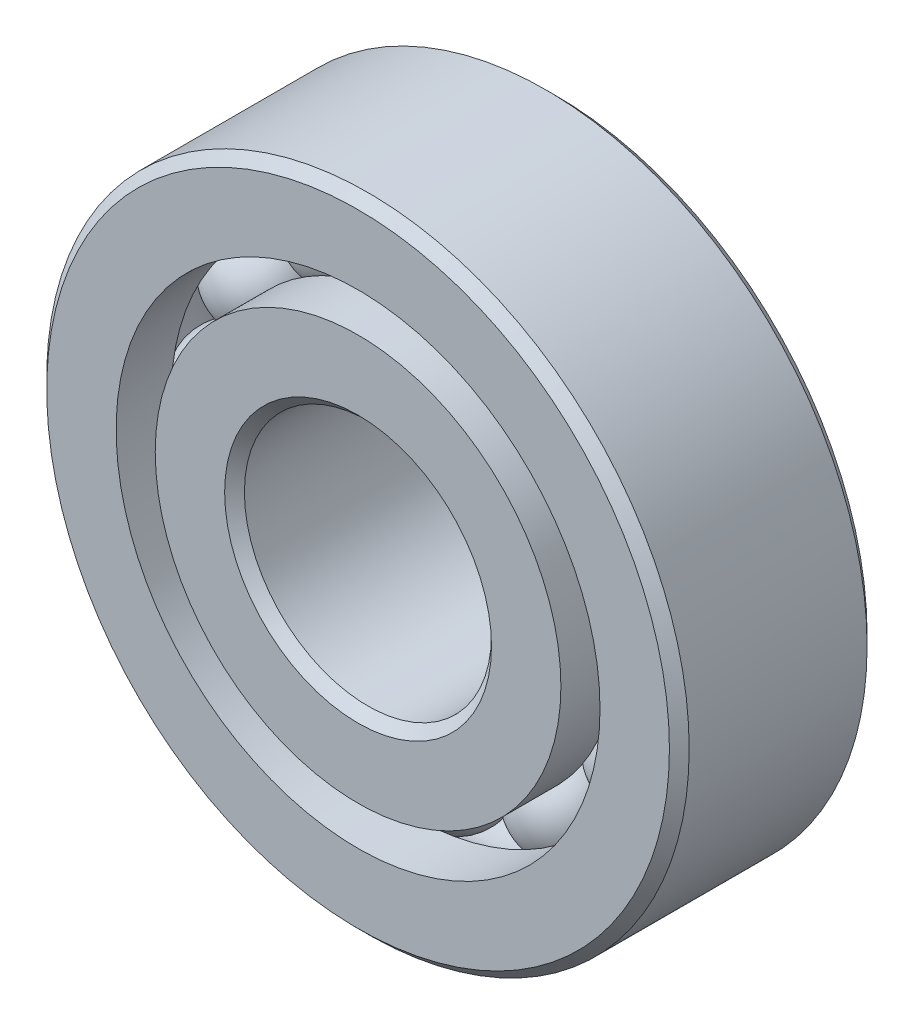
ISO-10303-21;
HEADER;
FILE_DESCRIPTION(('STEP AP214'),'2;1');
FILE_NAME('part.step','',(''),(''),'','','');
FILE_SCHEMA(('AUTOMOTIVE_DESIGN { 1 0 10303 214 1 1 1 1 }'));
ENDSEC;
DATA;
#1=APPLICATION_CONTEXT('core data for automotive mechanical design processes');
#2=APPLICATION_PROTOCOL_DEFINITION('international standard','automotive_design',2000,#1);
#3=PRODUCT_CONTEXT('',#1,'mechanical');
#4=PRODUCT('Part','Part','',(#3));
#5=PRODUCT_RELATED_PRODUCT_CATEGORY('part','',(#4));
#6=PRODUCT_DEFINITION_FORMATION('','',#4);
#7=PRODUCT_DEFINITION_CONTEXT('part definition',#1,'design');
#8=PRODUCT_DEFINITION('design','',#6,#7);
#9=PRODUCT_DEFINITION_SHAPE('','',#8);
#10=(LENGTH_UNIT() NAMED_UNIT(*) SI_UNIT(.MILLI.,.METRE.));
#11=(NAMED_UNIT(*) PLANE_ANGLE_UNIT() SI_UNIT($,.RADIAN.));
#12=(NAMED_UNIT(*) SI_UNIT($,.STERADIAN.) SOLID_ANGLE_UNIT());
#13=UNCERTAINTY_MEASURE_WITH_UNIT(LENGTH_MEASURE(1.E-05),#10,'distance_accuracy_value','');
#14=(GEOMETRIC_REPRESENTATION_CONTEXT(3) GLOBAL_UNCERTAINTY_ASSIGNED_CONTEXT((#13)) GLOBAL_UNIT_ASSIGNED_CONTEXT((#10,
#11,#12)) REPRESENTATION_CONTEXT('',''));
#15=CARTESIAN_POINT('',(0.,0.,0.));
#16=DIRECTION('',(0.,0.,1.));
#17=DIRECTION('',(1.,0.,0.));
#18=AXIS2_PLACEMENT_3D('',#15,#16,#17);
#19=CARTESIAN_POINT('',(-4.4999999999999,7.79422863406,0.));
#20=DIRECTION('',(0.,0.,1.));
#21=DIRECTION('',(-0.499999999999989,0.866025403784445,0.));
#22=AXIS2_PLACEMENT_3D('',#19,#20,#21);
#23=SPHERICAL_SURFACE('',#22,1.94589444175335);
#24=CARTESIAN_POINT('',(-4.4999999999999,7.79422863406,1.94589444175335));
#25=VERTEX_POINT('',#24);
#26=VERTEX_LOOP('',#25);
#27=FACE_BOUND('',#26,.T.);
#28=ADVANCED_FACE('F37',(#27),#23,.T.);
#29=CLOSED_SHELL('',(#28));
#30=MANIFOLD_SOLID_BREP('B2',#29);
#31=CARTESIAN_POINT('',(-7.79422863405989,4.50000000000009,0.));
#32=DIRECTION('',(0.,0.,1.));
#33=DIRECTION('',(-0.866025403784433,0.50000000000001,0.));
#34=AXIS2_PLACEMENT_3D('',#31,#32,#33);
#35=SPHERICAL_SURFACE('',#34,1.94589444175335);
#36=CARTESIAN_POINT('',(-7.79422863405989,4.50000000000009,1.94589444175335));
#37=VERTEX_POINT('',#36);
#38=VERTEX_LOOP('',#37);
#39=FACE_BOUND('',#38,.T.);
#40=ADVANCED_FACE('F57',(#39),#35,.T.);
#41=CLOSED_SHELL('',(#40));
#42=MANIFOLD_SOLID_BREP('B6',#41);
#43=CARTESIAN_POINT('',(-9.,0.,0.));
#44=DIRECTION('',(0.,0.,1.));
#45=DIRECTION('',(-1.,0.,0.));
#46=AXIS2_PLACEMENT_3D('',#43,#44,#45);
#47=SPHERICAL_SURFACE('',#46,1.94589444175335);
#48=CARTESIAN_POINT('',(-9.,0.,1.94589444175335));
#49=VERTEX_POINT('',#48);
#50=VERTEX_LOOP('',#49);
#51=FACE_BOUND('',#50,.T.);
#52=ADVANCED_FACE('F77',(#51),#47,.T.);
#53=CLOSED_SHELL('',(#52));
#54=MANIFOLD_SOLID_BREP('B33',#53);
#55=CARTESIAN_POINT('',(-7.79422863405999,-4.49999999999993,0.));
#56=DIRECTION('',(0.,0.,1.));
#57=DIRECTION('',(-0.866025403784443,-0.499999999999992,0.));
#58=AXIS2_PLACEMENT_3D('',#55,#56,#57);
#59=SPHERICAL_SURFACE('',#58,1.94589444175335);
#60=CARTESIAN_POINT('',(-7.79422863405999,-4.49999999999993,1.94589444175335));
#61=VERTEX_POINT('',#60);
#62=VERTEX_LOOP('',#61);
#63=FACE_BOUND('',#62,.T.);
#64=ADVANCED_FACE('F97',(#63),#59,.T.);
#65=CLOSED_SHELL('',(#64));
#66=MANIFOLD_SOLID_BREP('B53',#65);
#67=CARTESIAN_POINT('',(-4.50000000000006,-7.79422863405991,0.));
#68=DIRECTION('',(0.,0.,1.));
#69=DIRECTION('',(-0.500000000000007,-0.866025403784435,0.));
#70=AXIS2_PLACEMENT_3D('',#67,#68,#69);
#71=SPHERICAL_SURFACE('',#70,1.94589444175335);
#72=CARTESIAN_POINT('',(-4.50000000000006,-7.79422863405991,1.94589444175335));
#73=VERTEX_POINT('',#72);
#74=VERTEX_LOOP('',#73);
#75=FACE_BOUND('',#74,.T.);
#76=ADVANCED_FACE('F117',(#75),#71,.T.);
#77=CLOSED_SHELL('',(#76));
#78=MANIFOLD_SOLID_BREP('B73',#77);
#79=CARTESIAN_POINT('',(0.,-9.,0.));
#80=DIRECTION('',(0.,0.,1.));
#81=DIRECTION('',(0.,-1.,0.));
#82=AXIS2_PLACEMENT_3D('',#79,#80,#81);
#83=SPHERICAL_SURFACE('',#82,1.94589444175335);
#84=CARTESIAN_POINT('',(0.,-9.,1.94589444175335));
#85=VERTEX_POINT('',#84);
#86=VERTEX_LOOP('',#85);
#87=FACE_BOUND('',#86,.T.);
#88=ADVANCED_FACE('F137',(#87),#83,.T.);
#89=CLOSED_SHELL('',(#88));
#90=MANIFOLD_SOLID_BREP('B93',#89);
#91=CARTESIAN_POINT('',(4.49999999999995,-7.79422863405997,0.));
#92=DIRECTION('',(0.,0.,1.));
#93=DIRECTION('',(0.499999999999995,-0.866025403784442,0.));
#94=AXIS2_PLACEMENT_3D('',#91,#92,#93);
#95=SPHERICAL_SURFACE('',#94,1.94589444175335);
#96=CARTESIAN_POINT('',(4.49999999999995,-7.79422863405997,1.94589444175335));
#97=VERTEX_POINT('',#96);
#98=VERTEX_LOOP('',#97);
#99=FACE_BOUND('',#98,.T.);
#100=ADVANCED_FACE('F157',(#99),#95,.T.);
#101=CLOSED_SHELL('',(#100));
#102=MANIFOLD_SOLID_BREP('B113',#101);
#103=CARTESIAN_POINT('',(7.79422863405993,-4.50000000000004,0.));
#104=DIRECTION('',(0.,0.,1.));
#105=DIRECTION('',(0.866025403784436,-0.500000000000004,0.));
#106=AXIS2_PLACEMENT_3D('',#103,#104,#105);
#107=SPHERICAL_SURFACE('',#106,1.94589444175335);
#108=CARTESIAN_POINT('',(7.79422863405993,-4.50000000000004,1.94589444175335));
#109=VERTEX_POINT('',#108);
#110=VERTEX_LOOP('',#109);
#111=FACE_BOUND('',#110,.T.);
#112=ADVANCED_FACE('F177',(#111),#107,.T.);
#113=CLOSED_SHELL('',(#112));
#114=MANIFOLD_SOLID_BREP('B133',#113);
#115=CARTESIAN_POINT('',(9.,0.,0.));
#116=DIRECTION('',(0.,0.,1.));
#117=DIRECTION('',(1.,0.,0.));
#118=AXIS2_PLACEMENT_3D('',#115,#116,#117);
#119=SPHERICAL_SURFACE('',#118,1.94589444175335);
#120=CARTESIAN_POINT('',(9.,0.,1.94589444175335));
#121=VERTEX_POINT('',#120);
#122=VERTEX_LOOP('',#121);
#123=FACE_BOUND('',#122,.T.);
#124=ADVANCED_FACE('F197',(#123),#119,.T.);
#125=CLOSED_SHELL('',(#124));
#126=MANIFOLD_SOLID_BREP('B153',#125);
#127=CARTESIAN_POINT('',(7.79422863405996,4.49999999999998,0.));
#128=DIRECTION('',(0.,0.,1.));
#129=DIRECTION('',(0.86602540378444,0.499999999999998,0.));
#130=AXIS2_PLACEMENT_3D('',#127,#128,#129);
#131=SPHERICAL_SURFACE('',#130,1.94589444175335);
#132=CARTESIAN_POINT('',(7.79422863405996,4.49999999999998,1.94589444175335));
#133=VERTEX_POINT('',#132);
#134=VERTEX_LOOP('',#133);
#135=FACE_BOUND('',#134,.T.);
#136=ADVANCED_FACE('F217',(#135),#131,.T.);
#137=CLOSED_SHELL('',(#136));
#138=MANIFOLD_SOLID_BREP('B173',#137);
#139=CARTESIAN_POINT('',(4.50000000000001,7.79422863405994,0.));
#140=DIRECTION('',(0.,0.,1.));
#141=DIRECTION('',(0.500000000000001,0.866025403784438,0.));
#142=AXIS2_PLACEMENT_3D('',#139,#140,#141);
#143=SPHERICAL_SURFACE('',#142,1.94589444175335);
#144=CARTESIAN_POINT('',(4.50000000000001,7.79422863405994,1.94589444175335));
#145=VERTEX_POINT('',#144);
#146=VERTEX_LOOP('',#145);
#147=FACE_BOUND('',#146,.T.);
#148=ADVANCED_FACE('F237',(#147),#143,.T.);
#149=CLOSED_SHELL('',(#148));
#150=MANIFOLD_SOLID_BREP('B193',#149);
#151=CARTESIAN_POINT('',(0.,9.,0.));
#152=DIRECTION('',(0.,0.,1.));
#153=DIRECTION('',(0.,1.,0.));
#154=AXIS2_PLACEMENT_3D('',#151,#152,#153);
#155=SPHERICAL_SURFACE('',#154,1.94589444175335);
#156=CARTESIAN_POINT('',(0.,9.,1.94589444175335));
#157=VERTEX_POINT('',#156);
#158=VERTEX_LOOP('',#157);
#159=FACE_BOUND('',#158,.T.);
#160=ADVANCED_FACE('F259',(#159),#155,.T.);
#161=CLOSED_SHELL('',(#160));
#162=MANIFOLD_SOLID_BREP('B213',#161);
#163=CARTESIAN_POINT('',(0.,8.20879120879121,4.));
#164=DIRECTION('',(0.,0.,-1.));
#165=DIRECTION('',(-1.,0.,0.));
#166=AXIS2_PLACEMENT_3D('',#163,#164,#165);
#167=PLANE('',#166);
#168=CARTESIAN_POINT('',(0.,0.,4.));
#169=DIRECTION('',(0.,0.,1.));
#170=DIRECTION('',(1.,0.,0.));
#171=AXIS2_PLACEMENT_3D('',#168,#169,#170);
#172=CIRCLE('',#171,5.4);
#173=CARTESIAN_POINT('',(5.4,0.,4.));
#174=VERTEX_POINT('',#173);
#175=EDGE_CURVE('E306',#174,#174,#172,.T.);
#176=ORIENTED_EDGE('',*,*,#175,.F.);
#177=EDGE_LOOP('',(#176));
#178=FACE_BOUND('',#177,.T.);
#179=CARTESIAN_POINT('',(0.,0.,4.));
#180=DIRECTION('',(0.,0.,1.));
#181=DIRECTION('',(1.,0.,0.));
#182=AXIS2_PLACEMENT_3D('',#179,#180,#181);
#183=CIRCLE('',#182,8.20879120879121);
#184=CARTESIAN_POINT('',(8.20879120879121,0.,4.));
#185=VERTEX_POINT('',#184);
#186=EDGE_CURVE('E258',#185,#185,#183,.T.);
#187=ORIENTED_EDGE('',*,*,#186,.T.);
#188=EDGE_LOOP('',(#187));
#189=FACE_BOUND('',#188,.T.);
#190=ADVANCED_FACE('F278',(#178,#189),#167,.F.);
#191=CARTESIAN_POINT('',(0.,0.,4.));
#192=DIRECTION('',(0.,0.,1.));
#193=DIRECTION('',(1.,0.,0.));
#194=AXIS2_PLACEMENT_3D('',#191,#192,#193);
#195=CYLINDRICAL_SURFACE('',#194,8.20879120879121);
#196=ORIENTED_EDGE('',*,*,#186,.F.);
#197=EDGE_LOOP('',(#196));
#198=FACE_BOUND('',#197,.T.);
#199=CARTESIAN_POINT('',(0.,0.,1.77777777777778));
#200=DIRECTION('',(0.,0.,1.));
#201=DIRECTION('',(1.,0.,0.));
#202=AXIS2_PLACEMENT_3D('',#199,#200,#201);
#203=CIRCLE('',#202,8.20879120879121);
#204=CARTESIAN_POINT('',(8.20879120879121,0.,1.77777777777778));
#205=VERTEX_POINT('',#204);
#206=EDGE_CURVE('E284',#205,#205,#203,.T.);
#207=ORIENTED_EDGE('',*,*,#206,.T.);
#208=EDGE_LOOP('',(#207));
#209=FACE_BOUND('',#208,.T.);
#210=ADVANCED_FACE('F313',(#198,#209),#195,.T.);
#211=CARTESIAN_POINT('',(0.,0.,0.));
#212=DIRECTION('',(0.,0.,1.));
#213=DIRECTION('',(1.,0.,0.));
#214=AXIS2_PLACEMENT_3D('',#211,#212,#213);
#215=TOROIDAL_SURFACE('',#214,9.,1.94589444175334);
#216=ORIENTED_EDGE('',*,*,#206,.F.);
#217=EDGE_LOOP('',(#216));
#218=FACE_BOUND('',#217,.T.);
#219=CARTESIAN_POINT('',(0.,0.,-1.77777777777778));
#220=DIRECTION('',(0.,0.,1.));
#221=DIRECTION('',(1.,0.,0.));
#222=AXIS2_PLACEMENT_3D('',#219,#220,#221);
#223=CIRCLE('',#222,8.20879120879121);
#224=CARTESIAN_POINT('',(8.20879120879121,0.,-1.77777777777778));
#225=VERTEX_POINT('',#224);
#226=EDGE_CURVE('E288',#225,#225,#223,.T.);
#227=ORIENTED_EDGE('',*,*,#226,.T.);
#228=EDGE_LOOP('',(#227));
#229=FACE_BOUND('',#228,.T.);
#230=ADVANCED_FACE('F317',(#218,#229),#215,.F.);
#231=CARTESIAN_POINT('',(0.,0.,4.));
#232=DIRECTION('',(0.,0.,1.));
#233=DIRECTION('',(1.,0.,0.));
#234=AXIS2_PLACEMENT_3D('',#231,#232,#233);
#235=CYLINDRICAL_SURFACE('',#234,8.20879120879121);
#236=ORIENTED_EDGE('',*,*,#226,.F.);
#237=EDGE_LOOP('',(#236));
#238=FACE_BOUND('',#237,.T.);
#239=CARTESIAN_POINT('',(0.,0.,-4.));
#240=DIRECTION('',(0.,0.,1.));
#241=DIRECTION('',(1.,0.,0.));
#242=AXIS2_PLACEMENT_3D('',#239,#240,#241);
#243=CIRCLE('',#242,8.20879120879121);
#244=CARTESIAN_POINT('',(8.20879120879121,0.,-4.));
#245=VERTEX_POINT('',#244);
#246=EDGE_CURVE('E292',#245,#245,#243,.T.);
#247=ORIENTED_EDGE('',*,*,#246,.T.);
#248=EDGE_LOOP('',(#247));
#249=FACE_BOUND('',#248,.T.);
#250=ADVANCED_FACE('F322',(#238,#249),#235,.T.);
#251=CARTESIAN_POINT('',(0.,5.4,-4.));
#252=DIRECTION('',(0.,0.,1.));
#253=DIRECTION('',(1.,0.,0.));
#254=AXIS2_PLACEMENT_3D('',#251,#252,#253);
#255=PLANE('',#254);
#256=ORIENTED_EDGE('',*,*,#246,.F.);
#257=EDGE_LOOP('',(#256));
#258=FACE_BOUND('',#257,.T.);
#259=CARTESIAN_POINT('',(0.,0.,-4.));
#260=DIRECTION('',(0.,0.,1.));
#261=DIRECTION('',(1.,0.,0.));
#262=AXIS2_PLACEMENT_3D('',#259,#260,#261);
#263=CIRCLE('',#262,5.4);
#264=CARTESIAN_POINT('',(5.4,0.,-4.));
#265=VERTEX_POINT('',#264);
#266=EDGE_CURVE('E297',#265,#265,#263,.T.);
#267=ORIENTED_EDGE('',*,*,#266,.T.);
#268=EDGE_LOOP('',(#267));
#269=FACE_BOUND('',#268,.T.);
#270=ADVANCED_FACE('F328',(#258,#269),#255,.F.);
#271=CARTESIAN_POINT('',(0.,0.,-3.6));
#272=DIRECTION('',(0.,0.,-1.));
#273=DIRECTION('',(-1.,0.,0.));
#274=AXIS2_PLACEMENT_3D('',#271,#272,#273);
#275=CONICAL_SURFACE('',#274,5.,0.785398163397444);
#276=ORIENTED_EDGE('',*,*,#266,.F.);
#277=EDGE_LOOP('',(#276));
#278=FACE_BOUND('',#277,.T.);
#279=CARTESIAN_POINT('',(0.,0.,-3.6));
#280=DIRECTION('',(0.,0.,1.));
#281=DIRECTION('',(1.,0.,0.));
#282=AXIS2_PLACEMENT_3D('',#279,#280,#281);
#283=CIRCLE('',#282,5.);
#284=CARTESIAN_POINT('',(5.,0.,-3.6));
#285=VERTEX_POINT('',#284);
#286=EDGE_CURVE('E300',#285,#285,#283,.T.);
#287=ORIENTED_EDGE('',*,*,#286,.T.);
#288=EDGE_LOOP('',(#287));
#289=FACE_BOUND('',#288,.T.);
#290=ADVANCED_FACE('F332',(#278,#289),#275,.F.);
#291=CARTESIAN_POINT('',(0.,0.,4.));
#292=DIRECTION('',(0.,0.,1.));
#293=DIRECTION('',(1.,0.,0.));
#294=AXIS2_PLACEMENT_3D('',#291,#292,#293);
#295=CYLINDRICAL_SURFACE('',#294,5.);
#296=ORIENTED_EDGE('',*,*,#286,.F.);
#297=EDGE_LOOP('',(#296));
#298=FACE_BOUND('',#297,.T.);
#299=CARTESIAN_POINT('',(0.,0.,3.6));
#300=DIRECTION('',(0.,0.,1.));
#301=DIRECTION('',(1.,0.,0.));
#302=AXIS2_PLACEMENT_3D('',#299,#300,#301);
#303=CIRCLE('',#302,5.);
#304=CARTESIAN_POINT('',(5.,0.,3.6));
#305=VERTEX_POINT('',#304);
#306=EDGE_CURVE('E303',#305,#305,#303,.T.);
#307=ORIENTED_EDGE('',*,*,#306,.T.);
#308=EDGE_LOOP('',(#307));
#309=FACE_BOUND('',#308,.T.);
#310=ADVANCED_FACE('F336',(#298,#309),#295,.F.);
#311=CARTESIAN_POINT('',(0.,0.,4.));
#312=DIRECTION('',(0.,0.,1.));
#313=DIRECTION('',(1.,0.,0.));
#314=AXIS2_PLACEMENT_3D('',#311,#312,#313);
#315=CONICAL_SURFACE('',#314,5.4,0.785398163397452);
#316=ORIENTED_EDGE('',*,*,#306,.F.);
#317=EDGE_LOOP('',(#316));
#318=FACE_BOUND('',#317,.T.);
#319=ORIENTED_EDGE('',*,*,#175,.T.);
#320=EDGE_LOOP('',(#319));
#321=FACE_BOUND('',#320,.T.);
#322=ADVANCED_FACE('F310',(#318,#321),#315,.F.);
#323=CLOSED_SHELL('',(#190,#210,#230,#250,#270,#290,#310,#322));
#324=MANIFOLD_SOLID_BREP('B233',#323);
#325=CARTESIAN_POINT('',(0.,0.,3.6));
#326=DIRECTION('',(0.,0.,-1.));
#327=DIRECTION('',(-1.,0.,0.));
#328=AXIS2_PLACEMENT_3D('',#325,#326,#327);
#329=CONICAL_SURFACE('',#328,13.,0.785398163397447);
#330=CARTESIAN_POINT('',(0.,0.,4.));
#331=DIRECTION('',(0.,0.,1.));
#332=DIRECTION('',(1.,0.,0.));
#333=AXIS2_PLACEMENT_3D('',#330,#331,#332);
#334=CIRCLE('',#333,12.6);
#335=CARTESIAN_POINT('',(12.6,0.,4.));
#336=VERTEX_POINT('',#335);
#337=EDGE_CURVE('E427',#336,#336,#334,.T.);
#338=ORIENTED_EDGE('',*,*,#337,.F.);
#339=EDGE_LOOP('',(#338));
#340=FACE_BOUND('',#339,.T.);
#341=CARTESIAN_POINT('',(0.,0.,3.6));
#342=DIRECTION('',(0.,0.,1.));
#343=DIRECTION('',(1.,0.,0.));
#344=AXIS2_PLACEMENT_3D('',#341,#342,#343);
#345=CIRCLE('',#344,13.);
#346=CARTESIAN_POINT('',(13.,0.,3.6));
#347=VERTEX_POINT('',#346);
#348=EDGE_CURVE('E277',#347,#347,#345,.T.);
#349=ORIENTED_EDGE('',*,*,#348,.T.);
#350=EDGE_LOOP('',(#349));
#351=FACE_BOUND('',#350,.T.);
#352=ADVANCED_FACE('F399',(#340,#351),#329,.T.);
#353=CARTESIAN_POINT('',(0.,0.,4.));
#354=DIRECTION('',(0.,0.,1.));
#355=DIRECTION('',(1.,0.,0.));
#356=AXIS2_PLACEMENT_3D('',#353,#354,#355);
#357=CYLINDRICAL_SURFACE('',#356,13.);
#358=ORIENTED_EDGE('',*,*,#348,.F.);
#359=EDGE_LOOP('',(#358));
#360=FACE_BOUND('',#359,.T.);
#361=CARTESIAN_POINT('',(0.,0.,-3.6));
#362=DIRECTION('',(0.,0.,1.));
#363=DIRECTION('',(1.,0.,0.));
#364=AXIS2_PLACEMENT_3D('',#361,#362,#363);
#365=CIRCLE('',#364,13.);
#366=CARTESIAN_POINT('',(13.,0.,-3.6));
#367=VERTEX_POINT('',#366);
#368=EDGE_CURVE('E405',#367,#367,#365,.T.);
#369=ORIENTED_EDGE('',*,*,#368,.T.);
#370=EDGE_LOOP('',(#369));
#371=FACE_BOUND('',#370,.T.);
#372=ADVANCED_FACE('F434',(#360,#371),#357,.T.);
#373=CARTESIAN_POINT('',(0.,0.,-4.));
#374=DIRECTION('',(0.,0.,1.));
#375=DIRECTION('',(1.,0.,0.));
#376=AXIS2_PLACEMENT_3D('',#373,#374,#375);
#377=CONICAL_SURFACE('',#376,12.6,0.785398163397447);
#378=ORIENTED_EDGE('',*,*,#368,.F.);
#379=EDGE_LOOP('',(#378));
#380=FACE_BOUND('',#379,.T.);
#381=CARTESIAN_POINT('',(0.,0.,-4.));
#382=DIRECTION('',(0.,0.,1.));
#383=DIRECTION('',(1.,0.,0.));
#384=AXIS2_PLACEMENT_3D('',#381,#382,#383);
#385=CIRCLE('',#384,12.6);
#386=CARTESIAN_POINT('',(12.6,0.,-4.));
#387=VERTEX_POINT('',#386);
#388=EDGE_CURVE('E409',#387,#387,#385,.T.);
#389=ORIENTED_EDGE('',*,*,#388,.T.);
#390=EDGE_LOOP('',(#389));
#391=FACE_BOUND('',#390,.T.);
#392=ADVANCED_FACE('F438',(#380,#391),#377,.T.);
#393=CARTESIAN_POINT('',(0.,12.6,-4.));
#394=DIRECTION('',(0.,0.,1.));
#395=DIRECTION('',(1.,0.,0.));
#396=AXIS2_PLACEMENT_3D('',#393,#394,#395);
#397=PLANE('',#396);
#398=ORIENTED_EDGE('',*,*,#388,.F.);
#399=EDGE_LOOP('',(#398));
#400=FACE_BOUND('',#399,.T.);
#401=CARTESIAN_POINT('',(0.,0.,-4.));
#402=DIRECTION('',(0.,0.,1.));
#403=DIRECTION('',(1.,0.,0.));
#404=AXIS2_PLACEMENT_3D('',#401,#402,#403);
#405=CIRCLE('',#404,9.79120879120879);
#406=CARTESIAN_POINT('',(9.79120879120879,0.,-4.));
#407=VERTEX_POINT('',#406);
#408=EDGE_CURVE('E413',#407,#407,#405,.T.);
#409=ORIENTED_EDGE('',*,*,#408,.T.);
#410=EDGE_LOOP('',(#409));
#411=FACE_BOUND('',#410,.T.);
#412=ADVANCED_FACE('F443',(#400,#411),#397,.F.);
#413=CARTESIAN_POINT('',(0.,0.,4.));
#414=DIRECTION('',(0.,0.,1.));
#415=DIRECTION('',(1.,0.,0.));
#416=AXIS2_PLACEMENT_3D('',#413,#414,#415);
#417=CYLINDRICAL_SURFACE('',#416,9.79120879120879);
#418=ORIENTED_EDGE('',*,*,#408,.F.);
#419=EDGE_LOOP('',(#418));
#420=FACE_BOUND('',#419,.T.);
#421=CARTESIAN_POINT('',(0.,0.,-1.77777777777778));
#422=DIRECTION('',(0.,0.,1.));
#423=DIRECTION('',(1.,0.,0.));
#424=AXIS2_PLACEMENT_3D('',#421,#422,#423);
#425=CIRCLE('',#424,9.79120879120879);
#426=CARTESIAN_POINT('',(9.79120879120879,0.,-1.77777777777778));
#427=VERTEX_POINT('',#426);
#428=EDGE_CURVE('E418',#427,#427,#425,.T.);
#429=ORIENTED_EDGE('',*,*,#428,.T.);
#430=EDGE_LOOP('',(#429));
#431=FACE_BOUND('',#430,.T.);
#432=ADVANCED_FACE('F449',(#420,#431),#417,.F.);
#433=CARTESIAN_POINT('',(0.,0.,0.));
#434=DIRECTION('',(0.,0.,1.));
#435=DIRECTION('',(1.,0.,0.));
#436=AXIS2_PLACEMENT_3D('',#433,#434,#435);
#437=TOROIDAL_SURFACE('',#436,9.,1.94589444175335);
#438=ORIENTED_EDGE('',*,*,#428,.F.);
#439=EDGE_LOOP('',(#438));
#440=FACE_BOUND('',#439,.T.);
#441=CARTESIAN_POINT('',(0.,0.,1.77777777777778));
#442=DIRECTION('',(0.,0.,1.));
#443=DIRECTION('',(1.,0.,0.));
#444=AXIS2_PLACEMENT_3D('',#441,#442,#443);
#445=CIRCLE('',#444,9.79120879120879);
#446=CARTESIAN_POINT('',(9.79120879120879,0.,1.77777777777778));
#447=VERTEX_POINT('',#446);
#448=EDGE_CURVE('E421',#447,#447,#445,.T.);
#449=ORIENTED_EDGE('',*,*,#448,.T.);
#450=EDGE_LOOP('',(#449));
#451=FACE_BOUND('',#450,.T.);
#452=ADVANCED_FACE('F453',(#440,#451),#437,.F.);
#453=CARTESIAN_POINT('',(0.,0.,4.));
#454=DIRECTION('',(0.,0.,1.));
#455=DIRECTION('',(1.,0.,0.));
#456=AXIS2_PLACEMENT_3D('',#453,#454,#455);
#457=CYLINDRICAL_SURFACE('',#456,9.79120879120879);
#458=ORIENTED_EDGE('',*,*,#448,.F.);
#459=EDGE_LOOP('',(#458));
#460=FACE_BOUND('',#459,.T.);
#461=CARTESIAN_POINT('',(0.,0.,4.));
#462=DIRECTION('',(0.,0.,1.));
#463=DIRECTION('',(1.,0.,0.));
#464=AXIS2_PLACEMENT_3D('',#461,#462,#463);
#465=CIRCLE('',#464,9.79120879120879);
#466=CARTESIAN_POINT('',(9.79120879120879,0.,4.));
#467=VERTEX_POINT('',#466);
#468=EDGE_CURVE('E424',#467,#467,#465,.T.);
#469=ORIENTED_EDGE('',*,*,#468,.T.);
#470=EDGE_LOOP('',(#469));
#471=FACE_BOUND('',#470,.T.);
#472=ADVANCED_FACE('F457',(#460,#471),#457,.F.);
#473=CARTESIAN_POINT('',(0.,12.6,4.));
#474=DIRECTION('',(0.,0.,-1.));
#475=DIRECTION('',(-1.,0.,0.));
#476=AXIS2_PLACEMENT_3D('',#473,#474,#475);
#477=PLANE('',#476);
#478=ORIENTED_EDGE('',*,*,#468,.F.);
#479=EDGE_LOOP('',(#478));
#480=FACE_BOUND('',#479,.T.);
#481=ORIENTED_EDGE('',*,*,#337,.T.);
#482=EDGE_LOOP('',(#481));
#483=FACE_BOUND('',#482,.T.);
#484=ADVANCED_FACE('F431',(#480,#483),#477,.F.);
#485=CLOSED_SHELL('',(#352,#372,#392,#412,#432,#452,#472,#484));
#486=MANIFOLD_SOLID_BREP('B253',#485);
#487=ADVANCED_BREP_SHAPE_REPRESENTATION('',(#18,#30,#42,#54,#66,#78,#90,#102,#114,#126,#138,
#150,#162,#324,#486),#14);
#488=SHAPE_DEFINITION_REPRESENTATION(#9,#487);
ENDSEC;
END-ISO-10303-21;
